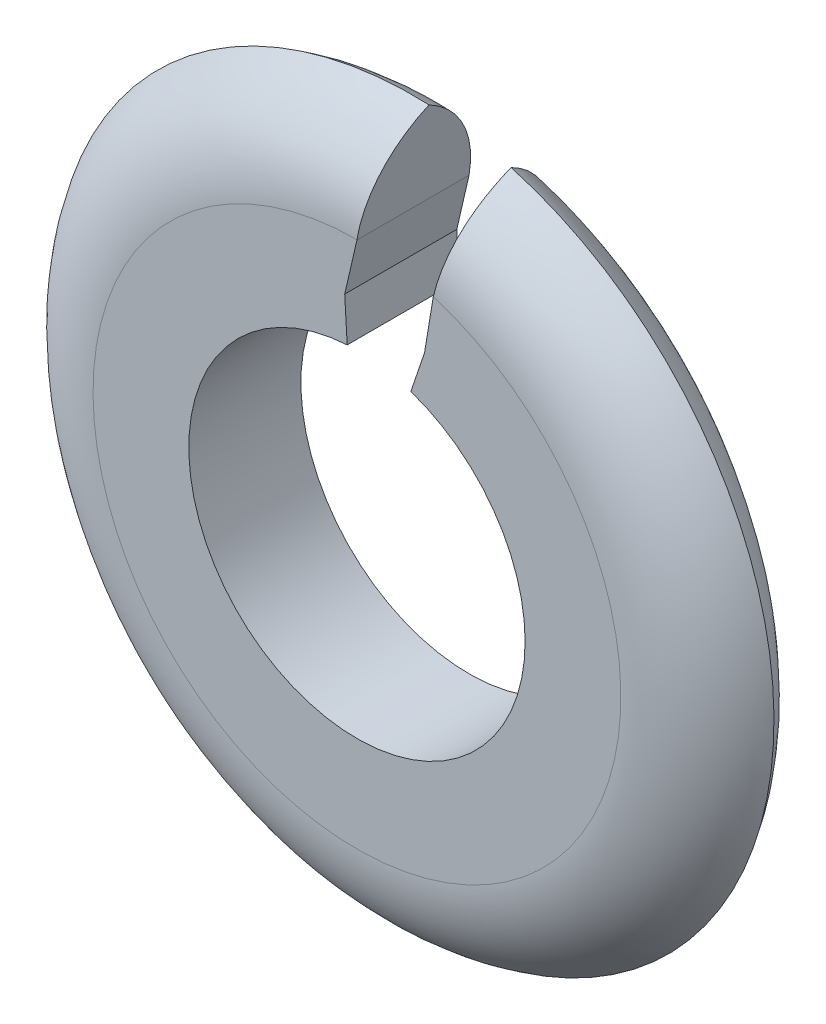
ISO-10303-21;
HEADER;
FILE_DESCRIPTION(('STEP AP214'),'2;1');
FILE_NAME('part.step','',(''),(''),'','','');
FILE_SCHEMA(('AUTOMOTIVE_DESIGN { 1 0 10303 214 1 1 1 1 }'));
ENDSEC;
DATA;
#1=APPLICATION_CONTEXT('core data for automotive mechanical design processes');
#2=APPLICATION_PROTOCOL_DEFINITION('international standard','automotive_design',2000,#1);
#3=PRODUCT_CONTEXT('',#1,'mechanical');
#4=PRODUCT('Part','Part','',(#3));
#5=PRODUCT_RELATED_PRODUCT_CATEGORY('part','',(#4));
#6=PRODUCT_DEFINITION_FORMATION('','',#4);
#7=PRODUCT_DEFINITION_CONTEXT('part definition',#1,'design');
#8=PRODUCT_DEFINITION('design','',#6,#7);
#9=PRODUCT_DEFINITION_SHAPE('','',#8);
#10=(LENGTH_UNIT() NAMED_UNIT(*) SI_UNIT(.MILLI.,.METRE.));
#11=(NAMED_UNIT(*) PLANE_ANGLE_UNIT() SI_UNIT($,.RADIAN.));
#12=(NAMED_UNIT(*) SI_UNIT($,.STERADIAN.) SOLID_ANGLE_UNIT());
#13=UNCERTAINTY_MEASURE_WITH_UNIT(LENGTH_MEASURE(1.E-05),#10,'distance_accuracy_value','');
#14=(GEOMETRIC_REPRESENTATION_CONTEXT(3) GLOBAL_UNCERTAINTY_ASSIGNED_CONTEXT((#13)) GLOBAL_UNIT_ASSIGNED_CONTEXT((#10,
#11,#12)) REPRESENTATION_CONTEXT('',''));
#15=CARTESIAN_POINT('',(0.,0.,0.));
#16=DIRECTION('',(0.,0.,1.));
#17=DIRECTION('',(1.,0.,0.));
#18=AXIS2_PLACEMENT_3D('',#15,#16,#17);
#19=CARTESIAN_POINT('',(-0.37809224499267,0.0624429736984906,1.));
#20=DIRECTION('',(-0.986635072247179,0.162945494604189,0.));
#21=DIRECTION('',(-0.162945494604189,-0.986635072247179,0.));
#22=AXIS2_PLACEMENT_3D('',#19,#20,#21);
#23=PLANE('',#22);
#24=DIRECTION('',(0.162945494604189,0.986635072247179,0.));
#25=VECTOR('',#24,1.);
#26=CARTESIAN_POINT('',(-0.37809224499267,0.0624429736984906,0.));
#27=LINE('',#26,#25);
#28=CARTESIAN_POINT('',(0.,2.35179175477765,0.));
#29=VERTEX_POINT('',#28);
#30=CARTESIAN_POINT('',(0.000387116883654524,2.3541357477515,0.));
#31=VERTEX_POINT('',#30);
#32=EDGE_CURVE('E144',#29,#31,#27,.T.);
#33=ORIENTED_EDGE('',*,*,#32,.T.);
#34=CARTESIAN_POINT('',(0.000387116883654524,2.3541357477515,0.));
#35=CARTESIAN_POINT('',(0.0050526848044625,2.38238576444452,2.57125135075312E-07));
#36=CARTESIAN_POINT('',(0.00971611084066983,2.41062281202493,0.00119793797243209));
#37=CARTESIAN_POINT('',(0.0190103187476169,2.46689924674334,0.00598354878910164));
#38=CARTESIAN_POINT('',(0.0236411002241249,2.49493863149425,0.00957150757483833));
#39=CARTESIAN_POINT('',(0.0374305118982026,2.57843352784808,0.0239021629026586));
#40=CARTESIAN_POINT('',(0.0464977633425294,2.63333574104267,0.0382116687570656));
#41=CARTESIAN_POINT('',(0.0641128516289732,2.73999511168899,0.076004485075555));
#42=CARTESIAN_POINT('',(0.0726602831374194,2.79174981484509,0.0994948510301314));
#43=CARTESIAN_POINT('',(0.0889821360408834,2.8905786444346,0.155016705280121));
#44=CARTESIAN_POINT('',(0.0967568162858827,2.93765433820482,0.187045320174623));
#45=CARTESIAN_POINT('',(0.111244321147091,3.02537618924551,0.258456075528868));
#46=CARTESIAN_POINT('',(0.117965405326872,3.0660723581786,0.297775129429498));
#47=CARTESIAN_POINT('',(0.130226683043992,3.14031440246254,0.382845031891112));
#48=CARTESIAN_POINT('',(0.135766642155912,3.17385885836734,0.428597154279401));
#49=CARTESIAN_POINT('',(0.145457570769766,3.23253743721542,0.524798225079139));
#50=CARTESIAN_POINT('',(0.149619910334626,3.25774040589687,0.575204097403744));
#51=CARTESIAN_POINT('',(0.156495561631907,3.29937247882358,0.679592820192611));
#52=CARTESIAN_POINT('',(0.159209879595322,3.31580767579813,0.73357315736033));
#53=CARTESIAN_POINT('',(0.162393907789937,3.33508696851783,0.823270461725095));
#54=CARTESIAN_POINT('',(0.163322033308645,3.34070676911698,0.858399554715627));
#55=CARTESIAN_POINT('',(0.164560068889816,3.34820307533913,0.929013953751062));
#56=CARTESIAN_POINT('',(0.164870874488886,3.35008500343685,0.96449866862754));
#57=CARTESIAN_POINT('',(0.164870260598804,3.35008128633202,1.));
#58=B_SPLINE_CURVE_WITH_KNOTS('',3,(#34,#35,#36,#37,#38,#39,#40,#41,#42,#43,#44,#45,#46,#47,#48,
#49,#50,#51,#52,#53,#54,#55,#56,#57),.UNSPECIFIED.,.F.,.F.,(4,2,2,2,2,2,2,2,2,2,2,4),(0.,
0.0858465692287708,0.171694173412819,0.343179343093996,0.514796559073777,0.686356092980081,
0.856495036981649,1.02666771817182,1.19539867376493,1.36401222488915,1.47058729286544,
1.5770076407615),.UNSPECIFIED.);
#59=CARTESIAN_POINT('',(0.142889763585743,3.21698936310218,0.5));
#60=VERTEX_POINT('',#59);
#61=EDGE_CURVE('E48',#31,#60,#58,.T.);
#62=ORIENTED_EDGE('',*,*,#61,.T.);
#63=CARTESIAN_POINT('',(0.164870260598804,3.35008128633202,0.));
#64=CARTESIAN_POINT('',(0.164870241251021,3.35008116918119,0.0279882675748096));
#65=CARTESIAN_POINT('',(0.164677413270533,3.34891359563813,0.0559630931650942));
#66=CARTESIAN_POINT('',(0.163908220243765,3.34425613137758,0.111711796151479));
#67=CARTESIAN_POINT('',(0.163331877228928,3.34076637406048,0.13948568499797));
#68=CARTESIAN_POINT('',(0.161033421319429,3.32684922208377,0.222150481595253));
#69=CARTESIAN_POINT('',(0.158741864139378,3.31297384191822,0.276486425196777));
#70=CARTESIAN_POINT('',(0.152705563139392,3.27642403556921,0.382022433682824));
#71=CARTESIAN_POINT('',(0.148960190072115,3.2537457992927,0.433221129563686));
#72=CARTESIAN_POINT('',(0.140125348193573,3.20025082616503,0.531044750945437));
#73=CARTESIAN_POINT('',(0.135036058960512,3.16943517665998,0.577670286385339));
#74=CARTESIAN_POINT('',(0.123647258177835,3.10047598076248,0.66514645947937));
#75=CARTESIAN_POINT('',(0.117345010578963,3.06231586759006,0.705983671853867));
#76=CARTESIAN_POINT('',(0.103717768418192,2.97980290774124,0.780640252098982));
#77=CARTESIAN_POINT('',(0.0963925929534561,2.93544896569805,0.814458376021331));
#78=CARTESIAN_POINT('',(0.0808800653948302,2.84152060158022,0.874347466079335));
#79=CARTESIAN_POINT('',(0.0726874924160965,2.79191456704458,0.900367433345176));
#80=CARTESIAN_POINT('',(0.0557123041366449,2.6891297913428,0.943675903147918));
#81=CARTESIAN_POINT('',(0.0469299203880455,2.6359524522249,0.960967809766476));
#82=CARTESIAN_POINT('',(0.0318173183057578,2.54444563711767,0.982439277330092));
#83=CARTESIAN_POINT('',(0.0255748381393835,2.50664741578659,0.989025005780421));
#84=CARTESIAN_POINT('',(0.0130179689872961,2.43061556517812,0.997805088620734));
#85=CARTESIAN_POINT('',(0.0067037032898609,2.39238268241135,1.00000608171807));
#86=CARTESIAN_POINT('',(0.000387116883654553,2.3541357477515,1.));
#87=B_SPLINE_CURVE_WITH_KNOTS('',3,(#63,#64,#65,#66,#67,#68,#69,#70,#71,#72,#73,#74,#75,#76,#77,
#78,#79,#80,#81,#82,#83,#84,#85,#86),.UNSPECIFIED.,.F.,.F.,(4,2,2,2,2,2,2,2,2,2,2,4),(0.,
0.0839131113759319,0.167821402686912,0.335336168066302,0.502923518956614,0.670488487632388,
0.838435955963303,1.00641316318571,1.17546607896766,1.34445301039435,1.46083337210411,
1.57703739383472),.UNSPECIFIED.);
#88=CARTESIAN_POINT('',(0.000387116883654524,2.3541357477515,1.));
#89=VERTEX_POINT('',#88);
#90=EDGE_CURVE('E58',#60,#89,#87,.T.);
#91=ORIENTED_EDGE('',*,*,#90,.T.);
#92=DIRECTION('',(0.162945494604189,0.986635072247179,0.));
#93=VECTOR('',#92,1.);
#94=CARTESIAN_POINT('',(-0.37809224499267,0.0624429736984906,1.));
#95=LINE('',#94,#93);
#96=CARTESIAN_POINT('',(0.,2.35179175477765,1.));
#97=VERTEX_POINT('',#96);
#98=EDGE_CURVE('E127',#97,#89,#95,.T.);
#99=ORIENTED_EDGE('',*,*,#98,.F.);
#100=DIRECTION('',(0.,0.,-1.));
#101=VECTOR('',#100,1.);
#102=CARTESIAN_POINT('',(0.,2.35179175477765,1.));
#103=LINE('',#102,#101);
#104=EDGE_CURVE('E143',#97,#29,#103,.T.);
#105=ORIENTED_EDGE('',*,*,#104,.T.);
#106=EDGE_LOOP('',(#33,#62,#91,#99,#105));
#107=FACE_BOUND('',#106,.T.);
#108=ADVANCED_FACE('F38',(#107),#23,.F.);
#109=CARTESIAN_POINT('',(0.154716228624086,-0.0355726423163341,1.));
#110=DIRECTION('',(-0.974571820148149,0.224075360923784,0.));
#111=DIRECTION('',(-0.224075360923784,-0.974571820148149,0.));
#112=AXIS2_PLACEMENT_3D('',#109,#110,#111);
#113=PLANE('',#112);
#114=CARTESIAN_POINT('',(0.681019251560844,2.2534790985728,1.));
#115=CARTESIAN_POINT('',(0.687342299484816,2.28097995497551,0.999999800883285));
#116=CARTESIAN_POINT('',(0.693662339818428,2.30846773045402,0.998810264295124));
#117=CARTESIAN_POINT('',(0.706257364066847,2.36324731735722,0.994063456911701));
#118=CARTESIAN_POINT('',(0.712532349675775,2.39053913615017,0.990506275619446));
#119=CARTESIAN_POINT('',(0.731212217311538,2.47178355555826,0.976314481977608));
#120=CARTESIAN_POINT('',(0.743492205958142,2.5251929569194,0.962159538745592));
#121=CARTESIAN_POINT('',(0.767345285527592,2.62893724668111,0.924844756386482));
#122=CARTESIAN_POINT('',(0.778917998921992,2.67927049309579,0.901680155843502));
#123=CARTESIAN_POINT('',(0.801025417072733,2.77542237100472,0.846999946619578));
#124=CARTESIAN_POINT('',(0.81156033183147,2.8212419158632,0.815486032234734));
#125=CARTESIAN_POINT('',(0.83127771418031,2.9069988019619,0.745046979195433));
#126=CARTESIAN_POINT('',(0.840462041617599,2.94694423224256,0.706132204731702));
#127=CARTESIAN_POINT('',(0.857235760206245,3.01989823034479,0.6219551286085));
#128=CARTESIAN_POINT('',(0.864824838136153,3.05290543587111,0.576691583294302));
#129=CARTESIAN_POINT('',(0.878179624139167,3.11098945746541,0.481178210057012));
#130=CARTESIAN_POINT('',(0.883947658325115,3.13607639050481,0.430934851840626));
#131=CARTESIAN_POINT('',(0.893506683617619,3.17765149559335,0.326847090575186));
#132=CARTESIAN_POINT('',(0.897298869087812,3.19414486229279,0.273004885224826));
#133=CARTESIAN_POINT('',(0.901845569624466,3.21391984424265,0.182354947277345));
#134=CARTESIAN_POINT('',(0.9031975909639,3.21980019580035,0.146121741706159));
#135=CARTESIAN_POINT('',(0.905001225722447,3.22764475132075,0.0732641311804812));
#136=CARTESIAN_POINT('',(0.905454120137913,3.22961452672576,0.036640357625469));
#137=CARTESIAN_POINT('',(0.905453105992223,3.22961011589804,0.));
#138=B_SPLINE_CURVE_WITH_KNOTS('',3,(#114,#115,#116,#117,#118,#119,#120,#121,#122,#123,#124,
#125,#126,#127,#128,#129,#130,#131,#132,#133,#134,#135,#136,#137),.UNSPECIFIED.,.F.,.F.,(4,2,2,
2,2,2,2,2,2,2,2,4),(0.,0.0846034123782436,0.169203626713458,0.338137102776473,0.507159978230359,
0.676148580718659,0.844902250717912,1.01368902400156,1.18225931668702,1.35072759321501,
1.46071747336217,1.5705505368976),.UNSPECIFIED.);
#139=CARTESIAN_POINT('',(0.681019251560844,2.2534790985728,1.));
#140=VERTEX_POINT('',#139);
#141=CARTESIAN_POINT('',(0.87539761400947,3.09888965021935,0.500000000000019));
#142=VERTEX_POINT('',#141);
#143=EDGE_CURVE('E119',#140,#142,#138,.T.);
#144=ORIENTED_EDGE('',*,*,#143,.T.);
#145=CARTESIAN_POINT('',(0.905453105992222,3.22961011589804,1.));
#146=CARTESIAN_POINT('',(0.905453066693362,3.22960994497536,0.971890330560412));
#147=CARTESIAN_POINT('',(0.905187060054833,3.22845300128992,0.943794133526044));
#148=CARTESIAN_POINT('',(0.904125869322151,3.22383756039713,0.887802922255601));
#149=CARTESIAN_POINT('',(0.903330711469557,3.22037917732229,0.859907898112341));
#150=CARTESIAN_POINT('',(0.900159151853537,3.20658510101265,0.776874536857082));
#151=CARTESIAN_POINT('',(0.896996642566522,3.1928303873334,0.722292603761161));
#152=CARTESIAN_POINT('',(0.888663453185004,3.15658681503833,0.616274829720065));
#153=CARTESIAN_POINT('',(0.883491825261765,3.13409383402738,0.564840486969441));
#154=CARTESIAN_POINT('',(0.871288307277139,3.08101702680745,0.466575792114647));
#155=CARTESIAN_POINT('',(0.864256731432044,3.05043456722059,0.419744664182762));
#156=CARTESIAN_POINT('',(0.848530310725883,2.98203558578491,0.331994433346817));
#157=CARTESIAN_POINT('',(0.839834825869953,2.944216280404,0.291077615948457));
#158=CARTESIAN_POINT('',(0.821027492150322,2.86241747227217,0.216322934559236));
#159=CARTESIAN_POINT('',(0.810915370956249,2.81843678507373,0.182486434795802));
#160=CARTESIAN_POINT('',(0.78955121233581,2.72551756866896,0.122818214489314));
#161=CARTESIAN_POINT('',(0.778297752627779,2.67657285352756,0.0969966485051388));
#162=CARTESIAN_POINT('',(0.754982294993864,2.57516684489638,0.0541489661789276));
#163=CARTESIAN_POINT('',(0.742920747514041,2.52270751053337,0.0371179950988977));
#164=CARTESIAN_POINT('',(0.722492825201581,2.43386027026642,0.0165000284546349));
#165=CARTESIAN_POINT('',(0.714253318624179,2.39802415294787,0.0103155799215721));
#166=CARTESIAN_POINT('',(0.697683405443676,2.32595656648301,0.00206606234206593));
#167=CARTESIAN_POINT('',(0.689353146362352,2.28972573895372,-4.90933338008444E-06));
#168=CARTESIAN_POINT('',(0.681019251560844,2.2534790985728,0.));
#169=B_SPLINE_CURVE_WITH_KNOTS('',3,(#145,#146,#147,#148,#149,#150,#151,#152,#153,#154,#155,
#156,#157,#158,#159,#160,#161,#162,#163,#164,#165,#166,#167,#168),.UNSPECIFIED.,.F.,.F.,(4,2,2,
2,2,2,2,2,2,2,2,4),(0.,0.0842771910906609,0.168550203035457,0.336813946071062,0.50515716637575,
0.673471965219837,0.841851634151635,1.01026371647042,1.17888830648463,1.34741967112781,
1.45906778198721,1.57055556743916),.UNSPECIFIED.);
#170=CARTESIAN_POINT('',(0.681019251560844,2.2534790985728,0.));
#171=VERTEX_POINT('',#170);
#172=EDGE_CURVE('E175',#142,#171,#169,.T.);
#173=ORIENTED_EDGE('',*,*,#172,.T.);
#174=DIRECTION('',(0.224075360923784,0.974571820148149,0.));
#175=VECTOR('',#174,1.);
#176=CARTESIAN_POINT('',(0.154716228624086,-0.0355726423163341,0.));
#177=LINE('',#176,#175);
#178=CARTESIAN_POINT('',(0.680492813786557,2.25118946075735,0.));
#179=VERTEX_POINT('',#178);
#180=EDGE_CURVE('E114',#179,#171,#177,.T.);
#181=ORIENTED_EDGE('',*,*,#180,.F.);
#182=DIRECTION('',(0.,0.,-1.));
#183=VECTOR('',#182,1.);
#184=CARTESIAN_POINT('',(0.680492813786557,2.25118946075735,1.));
#185=LINE('',#184,#183);
#186=CARTESIAN_POINT('',(0.680492813786557,2.25118946075735,1.));
#187=VERTEX_POINT('',#186);
#188=EDGE_CURVE('E108',#187,#179,#185,.T.);
#189=ORIENTED_EDGE('',*,*,#188,.F.);
#190=DIRECTION('',(0.224075360923784,0.974571820148149,0.));
#191=VECTOR('',#190,1.);
#192=CARTESIAN_POINT('',(0.154716228624086,-0.0355726423163341,1.));
#193=LINE('',#192,#191);
#194=EDGE_CURVE('E111',#187,#140,#193,.T.);
#195=ORIENTED_EDGE('',*,*,#194,.T.);
#196=EDGE_LOOP('',(#144,#173,#181,#189,#195));
#197=FACE_BOUND('',#196,.T.);
#198=ADVANCED_FACE('F110',(#197),#113,.T.);
#199=CARTESIAN_POINT('',(0.300506248148069,-0.0496294330229008,1.));
#200=DIRECTION('',(-0.986635072247179,0.162945494604189,0.));
#201=DIRECTION('',(-0.162945494604189,-0.986635072247179,0.));
#202=AXIS2_PLACEMENT_3D('',#199,#200,#201);
#203=PLANE('',#202);
#204=DIRECTION('',(0.162945494604189,0.986635072247179,0.));
#205=VECTOR('',#204,1.);
#206=CARTESIAN_POINT('',(0.300506248148069,-0.0496294330229008,0.));
#207=LINE('',#206,#205);
#208=CARTESIAN_POINT('',(0.603162473383737,1.78295420101257,0.));
#209=VERTEX_POINT('',#208);
#210=EDGE_CURVE('E147',#209,#179,#207,.T.);
#211=ORIENTED_EDGE('',*,*,#210,.F.);
#212=DIRECTION('',(0.,0.,-1.));
#213=VECTOR('',#212,1.);
#214=CARTESIAN_POINT('',(0.603162473383737,1.78295420101257,1.));
#215=LINE('',#214,#213);
#216=CARTESIAN_POINT('',(0.603162473383737,1.78295420101257,1.));
#217=VERTEX_POINT('',#216);
#218=EDGE_CURVE('E120',#217,#209,#215,.T.);
#219=ORIENTED_EDGE('',*,*,#218,.F.);
#220=DIRECTION('',(0.162945494604189,0.986635072247179,0.));
#221=VECTOR('',#220,1.);
#222=CARTESIAN_POINT('',(0.300506248148069,-0.0496294330229008,1.));
#223=LINE('',#222,#221);
#224=EDGE_CURVE('E125',#217,#187,#223,.T.);
#225=ORIENTED_EDGE('',*,*,#224,.T.);
#226=ORIENTED_EDGE('',*,*,#188,.T.);
#227=EDGE_LOOP('',(#211,#219,#225,#226));
#228=FACE_BOUND('',#227,.T.);
#229=ADVANCED_FACE('F129',(#228),#203,.T.);
#230=CARTESIAN_POINT('',(0.,0.,1.));
#231=DIRECTION('',(0.947264190784728,-0.32045366725465,0.));
#232=DIRECTION('',(0.32045366725465,0.947264190784728,0.));
#233=AXIS2_PLACEMENT_3D('',#230,#231,#232);
#234=PLANE('',#233);
#235=DIRECTION('',(-0.32045366725465,-0.947264190784728,0.));
#236=VECTOR('',#235,1.);
#237=CARTESIAN_POINT('',(0.,0.,0.));
#238=LINE('',#237,#236);
#239=CARTESIAN_POINT('',(0.480680500881975,1.42089628617709,0.));
#240=VERTEX_POINT('',#239);
#241=EDGE_CURVE('E149',#209,#240,#238,.T.);
#242=ORIENTED_EDGE('',*,*,#241,.T.);
#243=DIRECTION('',(0.,0.,-1.));
#244=VECTOR('',#243,1.);
#245=CARTESIAN_POINT('',(0.480680500881975,1.42089628617709,1.));
#246=LINE('',#245,#244);
#247=CARTESIAN_POINT('',(0.480680500881975,1.42089628617709,1.));
#248=VERTEX_POINT('',#247);
#249=EDGE_CURVE('E166',#248,#240,#246,.T.);
#250=ORIENTED_EDGE('',*,*,#249,.F.);
#251=DIRECTION('',(-0.32045366725465,-0.947264190784728,0.));
#252=VECTOR('',#251,1.);
#253=CARTESIAN_POINT('',(0.,0.,1.));
#254=LINE('',#253,#252);
#255=EDGE_CURVE('E131',#217,#248,#254,.T.);
#256=ORIENTED_EDGE('',*,*,#255,.F.);
#257=ORIENTED_EDGE('',*,*,#218,.T.);
#258=EDGE_LOOP('',(#242,#250,#256,#257));
#259=FACE_BOUND('',#258,.T.);
#260=ADVANCED_FACE('F235',(#259),#234,.F.);
#261=CARTESIAN_POINT('',(0.,0.,1.));
#262=DIRECTION('',(0.,0.,-1.));
#263=DIRECTION('',(-1.,0.,0.));
#264=AXIS2_PLACEMENT_3D('',#261,#262,#263);
#265=CYLINDRICAL_SURFACE('',#264,1.5);
#266=CARTESIAN_POINT('',(0.,0.,0.));
#267=DIRECTION('',(0.,0.,1.));
#268=DIRECTION('',(1.,0.,0.));
#269=AXIS2_PLACEMENT_3D('',#266,#267,#268);
#270=CIRCLE('',#269,1.5);
#271=CARTESIAN_POINT('',(-0.0870726939465755,1.49747064945156,0.));
#272=VERTEX_POINT('',#271);
#273=EDGE_CURVE('E152',#272,#240,#270,.T.);
#274=ORIENTED_EDGE('',*,*,#273,.F.);
#275=DIRECTION('',(0.,0.,-1.));
#276=VECTOR('',#275,1.);
#277=CARTESIAN_POINT('',(-0.0870726939465755,1.49747064945156,1.));
#278=LINE('',#277,#276);
#279=CARTESIAN_POINT('',(-0.0870726939465755,1.49747064945156,1.));
#280=VERTEX_POINT('',#279);
#281=EDGE_CURVE('E164',#280,#272,#278,.T.);
#282=ORIENTED_EDGE('',*,*,#281,.F.);
#283=CARTESIAN_POINT('',(0.,0.,1.));
#284=DIRECTION('',(0.,0.,1.));
#285=DIRECTION('',(1.,0.,0.));
#286=AXIS2_PLACEMENT_3D('',#283,#284,#285);
#287=CIRCLE('',#286,1.5);
#288=EDGE_CURVE('E133',#280,#248,#287,.T.);
#289=ORIENTED_EDGE('',*,*,#288,.T.);
#290=ORIENTED_EDGE('',*,*,#249,.T.);
#291=EDGE_LOOP('',(#274,#282,#289,#290));
#292=FACE_BOUND('',#291,.T.);
#293=ADVANCED_FACE('F232',(#292),#265,.F.);
#294=CARTESIAN_POINT('',(0.,0.,1.));
#295=DIRECTION('',(-0.998313766301042,-0.0580484626310503,0.));
#296=DIRECTION('',(0.0580484626310503,-0.998313766301042,0.));
#297=AXIS2_PLACEMENT_3D('',#294,#295,#296);
#298=PLANE('',#297);
#299=DIRECTION('',(-0.0580484626310503,0.998313766301042,0.));
#300=VECTOR('',#299,1.);
#301=CARTESIAN_POINT('',(0.,0.,0.));
#302=LINE('',#301,#300);
#303=CARTESIAN_POINT('',(-0.109259646165462,1.87904044180176,0.));
#304=VERTEX_POINT('',#303);
#305=EDGE_CURVE('E155',#272,#304,#302,.T.);
#306=ORIENTED_EDGE('',*,*,#305,.T.);
#307=DIRECTION('',(0.,0.,-1.));
#308=VECTOR('',#307,1.);
#309=CARTESIAN_POINT('',(-0.109259646165462,1.87904044180176,1.));
#310=LINE('',#309,#308);
#311=CARTESIAN_POINT('',(-0.109259646165462,1.87904044180176,1.));
#312=VERTEX_POINT('',#311);
#313=EDGE_CURVE('E161',#312,#304,#310,.T.);
#314=ORIENTED_EDGE('',*,*,#313,.F.);
#315=DIRECTION('',(-0.0580484626310503,0.998313766301042,0.));
#316=VECTOR('',#315,1.);
#317=CARTESIAN_POINT('',(0.,0.,1.));
#318=LINE('',#317,#316);
#319=EDGE_CURVE('E139',#280,#312,#318,.T.);
#320=ORIENTED_EDGE('',*,*,#319,.F.);
#321=ORIENTED_EDGE('',*,*,#281,.T.);
#322=EDGE_LOOP('',(#306,#314,#320,#321));
#323=FACE_BOUND('',#322,.T.);
#324=ADVANCED_FACE('F228',(#323),#298,.F.);
#325=CARTESIAN_POINT('',(-0.515972879378481,0.119248773476685,1.));
#326=DIRECTION('',(-0.974317454130019,0.225178814673135,0.));
#327=DIRECTION('',(-0.225178814673135,-0.974317454130019,0.));
#328=AXIS2_PLACEMENT_3D('',#325,#326,#327);
#329=PLANE('',#328);
#330=DIRECTION('',(0.225178814673135,0.974317454130019,0.));
#331=VECTOR('',#330,1.);
#332=CARTESIAN_POINT('',(-0.515972879378481,0.119248773476685,0.));
#333=LINE('',#332,#331);
#334=EDGE_CURVE('E157',#304,#29,#333,.T.);
#335=ORIENTED_EDGE('',*,*,#334,.T.);
#336=ORIENTED_EDGE('',*,*,#104,.F.);
#337=DIRECTION('',(0.225178814673135,0.974317454130019,0.));
#338=VECTOR('',#337,1.);
#339=CARTESIAN_POINT('',(-0.515972879378481,0.119248773476685,1.));
#340=LINE('',#339,#338);
#341=EDGE_CURVE('E141',#312,#97,#340,.T.);
#342=ORIENTED_EDGE('',*,*,#341,.F.);
#343=ORIENTED_EDGE('',*,*,#313,.T.);
#344=EDGE_LOOP('',(#335,#336,#342,#343));
#345=FACE_BOUND('',#344,.T.);
#346=ADVANCED_FACE('F223',(#345),#329,.F.);
#347=CARTESIAN_POINT('',(0.,0.,1.));
#348=DIRECTION('',(0.,0.,1.));
#349=DIRECTION('',(1.,0.,0.));
#350=AXIS2_PLACEMENT_3D('',#347,#348,#349);
#351=PLANE('',#350);
#352=ORIENTED_EDGE('',*,*,#98,.T.);
#353=CARTESIAN_POINT('',(0.,0.,1.));
#354=DIRECTION('',(0.,0.,1.));
#355=DIRECTION('',(1.,0.,0.));
#356=AXIS2_PLACEMENT_3D('',#353,#354,#355);
#357=CIRCLE('',#356,2.35413577958048);
#358=EDGE_CURVE('E11',#89,#140,#357,.T.);
#359=ORIENTED_EDGE('',*,*,#358,.T.);
#360=ORIENTED_EDGE('',*,*,#194,.F.);
#361=ORIENTED_EDGE('',*,*,#224,.F.);
#362=ORIENTED_EDGE('',*,*,#255,.T.);
#363=ORIENTED_EDGE('',*,*,#288,.F.);
#364=ORIENTED_EDGE('',*,*,#319,.T.);
#365=ORIENTED_EDGE('',*,*,#341,.T.);
#366=EDGE_LOOP('',(#352,#359,#360,#361,#362,#363,#364,#365));
#367=FACE_BOUND('',#366,.T.);
#368=ADVANCED_FACE('F124',(#367),#351,.T.);
#369=CARTESIAN_POINT('',(0.,0.,0.));
#370=DIRECTION('',(0.,0.,1.));
#371=DIRECTION('',(1.,0.,0.));
#372=AXIS2_PLACEMENT_3D('',#369,#370,#371);
#373=PLANE('',#372);
#374=ORIENTED_EDGE('',*,*,#180,.T.);
#375=CARTESIAN_POINT('',(0.,0.,0.));
#376=DIRECTION('',(0.,0.,1.));
#377=DIRECTION('',(1.,0.,0.));
#378=AXIS2_PLACEMENT_3D('',#375,#376,#377);
#379=CIRCLE('',#378,2.35413577958048);
#380=EDGE_CURVE('E202',#171,#31,#379,.F.);
#381=ORIENTED_EDGE('',*,*,#380,.T.);
#382=ORIENTED_EDGE('',*,*,#32,.F.);
#383=ORIENTED_EDGE('',*,*,#334,.F.);
#384=ORIENTED_EDGE('',*,*,#305,.F.);
#385=ORIENTED_EDGE('',*,*,#273,.T.);
#386=ORIENTED_EDGE('',*,*,#241,.F.);
#387=ORIENTED_EDGE('',*,*,#210,.T.);
#388=EDGE_LOOP('',(#374,#381,#382,#383,#384,#385,#386,#387));
#389=FACE_BOUND('',#388,.T.);
#390=ADVANCED_FACE('F211',(#389),#373,.F.);
#391=CARTESIAN_POINT('',(0.,0.,0.));
#392=DIRECTION('',(0.,0.,1.));
#393=DIRECTION('',(1.,0.,0.));
#394=AXIS2_PLACEMENT_3D('',#391,#392,#393);
#395=TOROIDAL_SURFACE('',#394,2.35413577958048,1.);
#396=ORIENTED_EDGE('',*,*,#358,.F.);
#397=ORIENTED_EDGE('',*,*,#90,.F.);
#398=CARTESIAN_POINT('',(0.,0.,0.5));
#399=DIRECTION('',(0.,0.,-1.));
#400=DIRECTION('',(-1.,0.,0.));
#401=AXIS2_PLACEMENT_3D('',#398,#399,#400);
#402=CIRCLE('',#401,3.22016118336492);
#403=EDGE_CURVE('E43',#142,#60,#402,.T.);
#404=ORIENTED_EDGE('',*,*,#403,.F.);
#405=ORIENTED_EDGE('',*,*,#143,.F.);
#406=EDGE_LOOP('',(#396,#397,#404,#405));
#407=FACE_BOUND('',#406,.T.);
#408=ADVANCED_FACE('F40',(#407),#395,.T.);
#409=CARTESIAN_POINT('',(0.,0.,1.));
#410=DIRECTION('',(0.,0.,1.));
#411=DIRECTION('',(1.,0.,0.));
#412=AXIS2_PLACEMENT_3D('',#409,#410,#411);
#413=TOROIDAL_SURFACE('',#412,2.35413577958048,1.);
#414=ORIENTED_EDGE('',*,*,#61,.F.);
#415=ORIENTED_EDGE('',*,*,#380,.F.);
#416=ORIENTED_EDGE('',*,*,#172,.F.);
#417=ORIENTED_EDGE('',*,*,#403,.T.);
#418=EDGE_LOOP('',(#414,#415,#416,#417));
#419=FACE_BOUND('',#418,.T.);
#420=ADVANCED_FACE('F189',(#419),#413,.T.);
#421=CLOSED_SHELL('',(#108,#198,#229,#260,#293,#324,#346,#368,#390,#408,#420));
#422=MANIFOLD_SOLID_BREP('B2',#421);
#423=ADVANCED_BREP_SHAPE_REPRESENTATION('',(#18,#422),#14);
#424=SHAPE_DEFINITION_REPRESENTATION(#9,#423);
ENDSEC;
END-ISO-10303-21;
